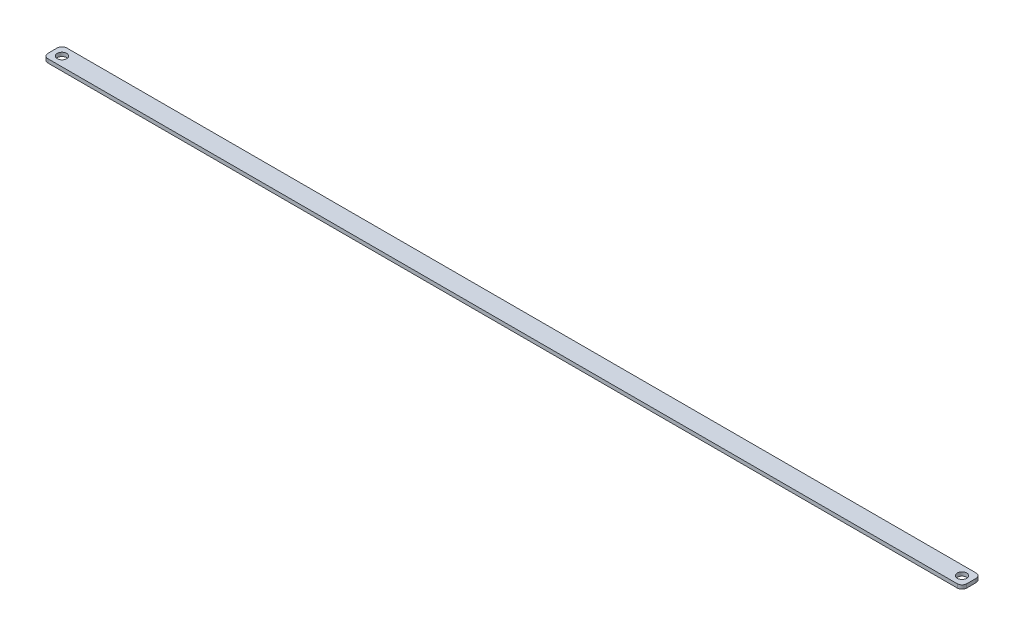
ISO-10303-21;
HEADER;
FILE_DESCRIPTION(('STEP AP214'),'2;1');
FILE_NAME('part.step','',(''),(''),'','','');
FILE_SCHEMA(('AUTOMOTIVE_DESIGN { 1 0 10303 214 1 1 1 1 }'));
ENDSEC;
DATA;
#1=APPLICATION_CONTEXT('core data for automotive mechanical design processes');
#2=APPLICATION_PROTOCOL_DEFINITION('international standard','automotive_design',2000,#1);
#3=PRODUCT_CONTEXT('',#1,'mechanical');
#4=PRODUCT('Part','Part','',(#3));
#5=PRODUCT_RELATED_PRODUCT_CATEGORY('part','',(#4));
#6=PRODUCT_DEFINITION_FORMATION('','',#4);
#7=PRODUCT_DEFINITION_CONTEXT('part definition',#1,'design');
#8=PRODUCT_DEFINITION('design','',#6,#7);
#9=PRODUCT_DEFINITION_SHAPE('','',#8);
#10=(LENGTH_UNIT() NAMED_UNIT(*) SI_UNIT(.MILLI.,.METRE.));
#11=(NAMED_UNIT(*) PLANE_ANGLE_UNIT() SI_UNIT($,.RADIAN.));
#12=(NAMED_UNIT(*) SI_UNIT($,.STERADIAN.) SOLID_ANGLE_UNIT());
#13=UNCERTAINTY_MEASURE_WITH_UNIT(LENGTH_MEASURE(1.E-05),#10,'distance_accuracy_value','');
#14=(GEOMETRIC_REPRESENTATION_CONTEXT(3) GLOBAL_UNCERTAINTY_ASSIGNED_CONTEXT((#13)) GLOBAL_UNIT_ASSIGNED_CONTEXT((#10,
#11,#12)) REPRESENTATION_CONTEXT('',''));
#15=CARTESIAN_POINT('',(0.,0.,0.));
#16=DIRECTION('',(0.,0.,1.));
#17=DIRECTION('',(1.,0.,0.));
#18=AXIS2_PLACEMENT_3D('',#15,#16,#17);
#19=CARTESIAN_POINT('',(270.312953067019,2.,-5.));
#20=DIRECTION('',(0.,-1.,0.));
#21=DIRECTION('',(0.,0.,-1.));
#22=AXIS2_PLACEMENT_3D('',#19,#20,#21);
#23=CYLINDRICAL_SURFACE('',#22,2.5);
#24=CARTESIAN_POINT('',(270.312953067019,0.,-5.));
#25=DIRECTION('',(0.,1.,0.));
#26=DIRECTION('',(0.,0.,1.));
#27=AXIS2_PLACEMENT_3D('',#24,#25,#26);
#28=CIRCLE('',#27,2.5);
#29=CARTESIAN_POINT('',(270.312953067019,0.,-2.5));
#30=VERTEX_POINT('',#29);
#31=EDGE_CURVE('E220',#30,#30,#28,.T.);
#32=ORIENTED_EDGE('',*,*,#31,.F.);
#33=EDGE_LOOP('',(#32));
#34=FACE_BOUND('',#33,.T.);
#35=CARTESIAN_POINT('',(270.312953067019,2.,-5.));
#36=DIRECTION('',(0.,1.,0.));
#37=DIRECTION('',(0.,0.,1.));
#38=AXIS2_PLACEMENT_3D('',#35,#36,#37);
#39=CIRCLE('',#38,2.5);
#40=CARTESIAN_POINT('',(270.312953067019,2.,-2.5));
#41=VERTEX_POINT('',#40);
#42=EDGE_CURVE('E13',#41,#41,#39,.T.);
#43=ORIENTED_EDGE('',*,*,#42,.T.);
#44=EDGE_LOOP('',(#43));
#45=FACE_BOUND('',#44,.T.);
#46=ADVANCED_FACE('F93',(#34,#45),#23,.F.);
#47=CARTESIAN_POINT('',(-209.687046932981,2.,-5.));
#48=DIRECTION('',(0.,-1.,0.));
#49=DIRECTION('',(0.,0.,-1.));
#50=AXIS2_PLACEMENT_3D('',#47,#48,#49);
#51=CYLINDRICAL_SURFACE('',#50,2.5);
#52=CARTESIAN_POINT('',(-209.687046932981,0.,-5.));
#53=DIRECTION('',(0.,1.,0.));
#54=DIRECTION('',(0.,0.,1.));
#55=AXIS2_PLACEMENT_3D('',#52,#53,#54);
#56=CIRCLE('',#55,2.5);
#57=CARTESIAN_POINT('',(-209.687046932981,0.,-2.5));
#58=VERTEX_POINT('',#57);
#59=EDGE_CURVE('E233',#58,#58,#56,.T.);
#60=ORIENTED_EDGE('',*,*,#59,.F.);
#61=EDGE_LOOP('',(#60));
#62=FACE_BOUND('',#61,.T.);
#63=CARTESIAN_POINT('',(-209.687046932981,2.,-5.));
#64=DIRECTION('',(0.,1.,0.));
#65=DIRECTION('',(0.,0.,1.));
#66=AXIS2_PLACEMENT_3D('',#63,#64,#65);
#67=CIRCLE('',#66,2.5);
#68=CARTESIAN_POINT('',(-209.687046932981,2.,-2.5));
#69=VERTEX_POINT('',#68);
#70=EDGE_CURVE('E103',#69,#69,#67,.T.);
#71=ORIENTED_EDGE('',*,*,#70,.T.);
#72=EDGE_LOOP('',(#71));
#73=FACE_BOUND('',#72,.T.);
#74=ADVANCED_FACE('F254',(#62,#73),#51,.F.);
#75=CARTESIAN_POINT('',(47.5,2.,-2.5));
#76=DIRECTION('',(0.,1.,0.));
#77=DIRECTION('',(0.,0.,1.));
#78=AXIS2_PLACEMENT_3D('',#75,#76,#77);
#79=PLANE('',#78);
#80=DIRECTION('',(1.,0.,0.));
#81=VECTOR('',#80,1.);
#82=CARTESIAN_POINT('',(-212.187046932981,2.,0.));
#83=LINE('',#82,#81);
#84=CARTESIAN_POINT('',(-212.187046932981,2.,0.));
#85=VERTEX_POINT('',#84);
#86=CARTESIAN_POINT('',(272.812953067019,2.,0.));
#87=VERTEX_POINT('',#86);
#88=EDGE_CURVE('E156',#85,#87,#83,.T.);
#89=ORIENTED_EDGE('',*,*,#88,.T.);
#90=CARTESIAN_POINT('',(272.812953067019,2.,-2.5));
#91=DIRECTION('',(0.,1.,0.));
#92=DIRECTION('',(0.,0.,1.));
#93=AXIS2_PLACEMENT_3D('',#90,#91,#92);
#94=CIRCLE('',#93,2.5);
#95=CARTESIAN_POINT('',(275.312953067019,2.,-2.50000000000002));
#96=VERTEX_POINT('',#95);
#97=EDGE_CURVE('E162',#87,#96,#94,.T.);
#98=ORIENTED_EDGE('',*,*,#97,.T.);
#99=DIRECTION('',(0.,0.,-1.));
#100=VECTOR('',#99,1.);
#101=CARTESIAN_POINT('',(275.312953067019,2.,-2.50000000000002));
#102=LINE('',#101,#100);
#103=CARTESIAN_POINT('',(275.312953067019,2.,-7.49999999999998));
#104=VERTEX_POINT('',#103);
#105=EDGE_CURVE('E184',#96,#104,#102,.T.);
#106=ORIENTED_EDGE('',*,*,#105,.T.);
#107=CARTESIAN_POINT('',(272.812953067019,2.,-7.5));
#108=DIRECTION('',(0.,1.,0.));
#109=DIRECTION('',(0.,0.,-1.));
#110=AXIS2_PLACEMENT_3D('',#107,#108,#109);
#111=CIRCLE('',#110,2.5);
#112=CARTESIAN_POINT('',(272.812953067019,2.,-10.));
#113=VERTEX_POINT('',#112);
#114=EDGE_CURVE('E188',#104,#113,#111,.T.);
#115=ORIENTED_EDGE('',*,*,#114,.T.);
#116=DIRECTION('',(-1.,0.,0.));
#117=VECTOR('',#116,1.);
#118=CARTESIAN_POINT('',(227.812953067019,2.,-10.));
#119=LINE('',#118,#117);
#120=CARTESIAN_POINT('',(-212.187046932981,2.,-10.));
#121=VERTEX_POINT('',#120);
#122=EDGE_CURVE('E242',#113,#121,#119,.T.);
#123=ORIENTED_EDGE('',*,*,#122,.T.);
#124=CARTESIAN_POINT('',(-212.187046932981,2.,-7.5));
#125=DIRECTION('',(0.,1.,0.));
#126=DIRECTION('',(0.,0.,-1.));
#127=AXIS2_PLACEMENT_3D('',#124,#125,#126);
#128=CIRCLE('',#127,2.5);
#129=CARTESIAN_POINT('',(-214.687046932981,2.,-7.49999999999998));
#130=VERTEX_POINT('',#129);
#131=EDGE_CURVE('E168',#121,#130,#128,.T.);
#132=ORIENTED_EDGE('',*,*,#131,.T.);
#133=DIRECTION('',(0.,0.,1.));
#134=VECTOR('',#133,1.);
#135=CARTESIAN_POINT('',(-214.687046932981,2.,-2.50000000000002));
#136=LINE('',#135,#134);
#137=CARTESIAN_POINT('',(-214.687046932981,2.,-2.50000000000002));
#138=VERTEX_POINT('',#137);
#139=EDGE_CURVE('E186',#130,#138,#136,.T.);
#140=ORIENTED_EDGE('',*,*,#139,.T.);
#141=CARTESIAN_POINT('',(-212.187046932981,2.,-2.5));
#142=DIRECTION('',(0.,1.,0.));
#143=DIRECTION('',(0.,0.,-1.));
#144=AXIS2_PLACEMENT_3D('',#141,#142,#143);
#145=CIRCLE('',#144,2.5);
#146=EDGE_CURVE('E165',#138,#85,#145,.T.);
#147=ORIENTED_EDGE('',*,*,#146,.T.);
#148=EDGE_LOOP('',(#89,#98,#106,#115,#123,#132,#140,#147));
#149=FACE_BOUND('',#148,.T.);
#150=ORIENTED_EDGE('',*,*,#42,.F.);
#151=EDGE_LOOP('',(#150));
#152=FACE_BOUND('',#151,.T.);
#153=ORIENTED_EDGE('',*,*,#70,.F.);
#154=EDGE_LOOP('',(#153));
#155=FACE_BOUND('',#154,.T.);
#156=ADVANCED_FACE('F158',(#149,#152,#155),#79,.T.);
#157=CARTESIAN_POINT('',(272.812953067019,0.,-2.5));
#158=DIRECTION('',(0.,1.,0.));
#159=DIRECTION('',(0.,0.,1.));
#160=AXIS2_PLACEMENT_3D('',#157,#158,#159);
#161=PLANE('',#160);
#162=ORIENTED_EDGE('',*,*,#31,.T.);
#163=EDGE_LOOP('',(#162));
#164=FACE_BOUND('',#163,.T.);
#165=CARTESIAN_POINT('',(272.812953067019,0.,-2.5));
#166=DIRECTION('',(0.,1.,0.));
#167=DIRECTION('',(0.,0.,1.));
#168=AXIS2_PLACEMENT_3D('',#165,#166,#167);
#169=CIRCLE('',#168,2.5);
#170=CARTESIAN_POINT('',(272.812953067019,0.,0.));
#171=VERTEX_POINT('',#170);
#172=CARTESIAN_POINT('',(275.312953067019,0.,-2.50000000000002));
#173=VERTEX_POINT('',#172);
#174=EDGE_CURVE('E177',#171,#173,#169,.T.);
#175=ORIENTED_EDGE('',*,*,#174,.F.);
#176=DIRECTION('',(1.,0.,0.));
#177=VECTOR('',#176,1.);
#178=CARTESIAN_POINT('',(-212.187046932981,0.,0.));
#179=LINE('',#178,#177);
#180=CARTESIAN_POINT('',(-212.187046932981,0.,0.));
#181=VERTEX_POINT('',#180);
#182=EDGE_CURVE('E173',#181,#171,#179,.T.);
#183=ORIENTED_EDGE('',*,*,#182,.F.);
#184=CARTESIAN_POINT('',(-212.187046932981,0.,-2.5));
#185=DIRECTION('',(0.,1.,0.));
#186=DIRECTION('',(0.,0.,-1.));
#187=AXIS2_PLACEMENT_3D('',#184,#185,#186);
#188=CIRCLE('',#187,2.5);
#189=CARTESIAN_POINT('',(-214.687046932981,0.,-2.50000000000002));
#190=VERTEX_POINT('',#189);
#191=EDGE_CURVE('E199',#190,#181,#188,.T.);
#192=ORIENTED_EDGE('',*,*,#191,.F.);
#193=DIRECTION('',(0.,0.,1.));
#194=VECTOR('',#193,1.);
#195=CARTESIAN_POINT('',(-214.687046932981,0.,-2.50000000000002));
#196=LINE('',#195,#194);
#197=CARTESIAN_POINT('',(-214.687046932981,0.,-7.49999999999998));
#198=VERTEX_POINT('',#197);
#199=EDGE_CURVE('E206',#198,#190,#196,.T.);
#200=ORIENTED_EDGE('',*,*,#199,.F.);
#201=CARTESIAN_POINT('',(-212.187046932981,0.,-7.5));
#202=DIRECTION('',(0.,1.,0.));
#203=DIRECTION('',(0.,0.,-1.));
#204=AXIS2_PLACEMENT_3D('',#201,#202,#203);
#205=CIRCLE('',#204,2.5);
#206=CARTESIAN_POINT('',(-212.187046932981,0.,-10.));
#207=VERTEX_POINT('',#206);
#208=EDGE_CURVE('E212',#207,#198,#205,.T.);
#209=ORIENTED_EDGE('',*,*,#208,.F.);
#210=DIRECTION('',(-1.,0.,0.));
#211=VECTOR('',#210,1.);
#212=CARTESIAN_POINT('',(227.812953067019,0.,-10.));
#213=LINE('',#212,#211);
#214=CARTESIAN_POINT('',(272.812953067019,0.,-10.));
#215=VERTEX_POINT('',#214);
#216=EDGE_CURVE('E218',#215,#207,#213,.T.);
#217=ORIENTED_EDGE('',*,*,#216,.F.);
#218=CARTESIAN_POINT('',(272.812953067019,0.,-7.5));
#219=DIRECTION('',(0.,1.,0.));
#220=DIRECTION('',(0.,0.,-1.));
#221=AXIS2_PLACEMENT_3D('',#218,#219,#220);
#222=CIRCLE('',#221,2.5);
#223=CARTESIAN_POINT('',(275.312953067019,0.,-7.49999999999998));
#224=VERTEX_POINT('',#223);
#225=EDGE_CURVE('E223',#224,#215,#222,.T.);
#226=ORIENTED_EDGE('',*,*,#225,.F.);
#227=DIRECTION('',(0.,0.,-1.));
#228=VECTOR('',#227,1.);
#229=CARTESIAN_POINT('',(275.312953067019,0.,-2.50000000000002));
#230=LINE('',#229,#228);
#231=EDGE_CURVE('E178',#173,#224,#230,.T.);
#232=ORIENTED_EDGE('',*,*,#231,.F.);
#233=EDGE_LOOP('',(#175,#183,#192,#200,#209,#217,#226,#232));
#234=FACE_BOUND('',#233,.T.);
#235=ORIENTED_EDGE('',*,*,#59,.T.);
#236=EDGE_LOOP('',(#235));
#237=FACE_BOUND('',#236,.T.);
#238=ADVANCED_FACE('F249',(#164,#234,#237),#161,.F.);
#239=CARTESIAN_POINT('',(227.812953067019,2.,-10.));
#240=DIRECTION('',(0.,0.,1.));
#241=DIRECTION('',(1.,0.,0.));
#242=AXIS2_PLACEMENT_3D('',#239,#240,#241);
#243=PLANE('',#242);
#244=ORIENTED_EDGE('',*,*,#216,.T.);
#245=DIRECTION('',(0.,-1.,0.));
#246=VECTOR('',#245,1.);
#247=CARTESIAN_POINT('',(-212.187046932981,2.,-10.));
#248=LINE('',#247,#246);
#249=EDGE_CURVE('E209',#121,#207,#248,.T.);
#250=ORIENTED_EDGE('',*,*,#249,.F.);
#251=ORIENTED_EDGE('',*,*,#122,.F.);
#252=DIRECTION('',(0.,-1.,0.));
#253=VECTOR('',#252,1.);
#254=CARTESIAN_POINT('',(272.812953067019,2.,-10.));
#255=LINE('',#254,#253);
#256=EDGE_CURVE('E112',#113,#215,#255,.T.);
#257=ORIENTED_EDGE('',*,*,#256,.T.);
#258=EDGE_LOOP('',(#244,#250,#251,#257));
#259=FACE_BOUND('',#258,.T.);
#260=ADVANCED_FACE('F271',(#259),#243,.F.);
#261=CARTESIAN_POINT('',(227.812953067019,2.,0.));
#262=DIRECTION('',(0.,0.,-1.));
#263=DIRECTION('',(-1.,0.,0.));
#264=AXIS2_PLACEMENT_3D('',#261,#262,#263);
#265=PLANE('',#264);
#266=DIRECTION('',(0.,-1.,0.));
#267=VECTOR('',#266,1.);
#268=CARTESIAN_POINT('',(272.812953067019,2.,0.));
#269=LINE('',#268,#267);
#270=EDGE_CURVE('E171',#87,#171,#269,.T.);
#271=ORIENTED_EDGE('',*,*,#270,.F.);
#272=ORIENTED_EDGE('',*,*,#88,.F.);
#273=DIRECTION('',(0.,-1.,0.));
#274=VECTOR('',#273,1.);
#275=CARTESIAN_POINT('',(-212.187046932981,2.,0.));
#276=LINE('',#275,#274);
#277=EDGE_CURVE('E196',#85,#181,#276,.T.);
#278=ORIENTED_EDGE('',*,*,#277,.T.);
#279=ORIENTED_EDGE('',*,*,#182,.T.);
#280=EDGE_LOOP('',(#271,#272,#278,#279));
#281=FACE_BOUND('',#280,.T.);
#282=ADVANCED_FACE('F172',(#281),#265,.F.);
#283=CARTESIAN_POINT('',(272.812953067019,2.,-2.5));
#284=DIRECTION('',(0.,-1.,0.));
#285=DIRECTION('',(0.,0.,-1.));
#286=AXIS2_PLACEMENT_3D('',#283,#284,#285);
#287=CYLINDRICAL_SURFACE('',#286,2.5);
#288=ORIENTED_EDGE('',*,*,#174,.T.);
#289=DIRECTION('',(0.,-1.,0.));
#290=VECTOR('',#289,1.);
#291=CARTESIAN_POINT('',(275.312953067019,2.,-2.50000000000002));
#292=LINE('',#291,#290);
#293=EDGE_CURVE('E182',#96,#173,#292,.T.);
#294=ORIENTED_EDGE('',*,*,#293,.F.);
#295=ORIENTED_EDGE('',*,*,#97,.F.);
#296=ORIENTED_EDGE('',*,*,#270,.T.);
#297=EDGE_LOOP('',(#288,#294,#295,#296));
#298=FACE_BOUND('',#297,.T.);
#299=ADVANCED_FACE('F180',(#298),#287,.T.);
#300=CARTESIAN_POINT('',(275.312953067019,2.,-2.50000000000002));
#301=DIRECTION('',(-1.,0.,0.));
#302=DIRECTION('',(0.,0.,1.));
#303=AXIS2_PLACEMENT_3D('',#300,#301,#302);
#304=PLANE('',#303);
#305=ORIENTED_EDGE('',*,*,#231,.T.);
#306=DIRECTION('',(0.,-1.,0.));
#307=VECTOR('',#306,1.);
#308=CARTESIAN_POINT('',(275.312953067019,2.,-7.49999999999998));
#309=LINE('',#308,#307);
#310=EDGE_CURVE('E215',#104,#224,#309,.T.);
#311=ORIENTED_EDGE('',*,*,#310,.F.);
#312=ORIENTED_EDGE('',*,*,#105,.F.);
#313=ORIENTED_EDGE('',*,*,#293,.T.);
#314=EDGE_LOOP('',(#305,#311,#312,#313));
#315=FACE_BOUND('',#314,.T.);
#316=ADVANCED_FACE('F278',(#315),#304,.F.);
#317=CARTESIAN_POINT('',(272.812953067019,2.,-7.5));
#318=DIRECTION('',(0.,-1.,0.));
#319=DIRECTION('',(0.,0.,-1.));
#320=AXIS2_PLACEMENT_3D('',#317,#318,#319);
#321=CYLINDRICAL_SURFACE('',#320,2.5);
#322=ORIENTED_EDGE('',*,*,#225,.T.);
#323=ORIENTED_EDGE('',*,*,#256,.F.);
#324=ORIENTED_EDGE('',*,*,#114,.F.);
#325=ORIENTED_EDGE('',*,*,#310,.T.);
#326=EDGE_LOOP('',(#322,#323,#324,#325));
#327=FACE_BOUND('',#326,.T.);
#328=ADVANCED_FACE('F281',(#327),#321,.T.);
#329=CARTESIAN_POINT('',(-212.187046932981,2.,-7.5));
#330=DIRECTION('',(0.,-1.,0.));
#331=DIRECTION('',(0.,0.,-1.));
#332=AXIS2_PLACEMENT_3D('',#329,#330,#331);
#333=CYLINDRICAL_SURFACE('',#332,2.5);
#334=ORIENTED_EDGE('',*,*,#208,.T.);
#335=DIRECTION('',(0.,-1.,0.));
#336=VECTOR('',#335,1.);
#337=CARTESIAN_POINT('',(-214.687046932981,2.,-7.49999999999998));
#338=LINE('',#337,#336);
#339=EDGE_CURVE('E202',#130,#198,#338,.T.);
#340=ORIENTED_EDGE('',*,*,#339,.F.);
#341=ORIENTED_EDGE('',*,*,#131,.F.);
#342=ORIENTED_EDGE('',*,*,#249,.T.);
#343=EDGE_LOOP('',(#334,#340,#341,#342));
#344=FACE_BOUND('',#343,.T.);
#345=ADVANCED_FACE('F285',(#344),#333,.T.);
#346=CARTESIAN_POINT('',(-214.687046932981,2.,-2.50000000000002));
#347=DIRECTION('',(1.,0.,0.));
#348=DIRECTION('',(0.,0.,-1.));
#349=AXIS2_PLACEMENT_3D('',#346,#347,#348);
#350=PLANE('',#349);
#351=ORIENTED_EDGE('',*,*,#199,.T.);
#352=DIRECTION('',(0.,-1.,0.));
#353=VECTOR('',#352,1.);
#354=CARTESIAN_POINT('',(-214.687046932981,2.,-2.50000000000002));
#355=LINE('',#354,#353);
#356=EDGE_CURVE('E203',#138,#190,#355,.T.);
#357=ORIENTED_EDGE('',*,*,#356,.F.);
#358=ORIENTED_EDGE('',*,*,#139,.F.);
#359=ORIENTED_EDGE('',*,*,#339,.T.);
#360=EDGE_LOOP('',(#351,#357,#358,#359));
#361=FACE_BOUND('',#360,.T.);
#362=ADVANCED_FACE('F288',(#361),#350,.F.);
#363=CARTESIAN_POINT('',(-212.187046932981,2.,-2.5));
#364=DIRECTION('',(0.,-1.,0.));
#365=DIRECTION('',(0.,0.,-1.));
#366=AXIS2_PLACEMENT_3D('',#363,#364,#365);
#367=CYLINDRICAL_SURFACE('',#366,2.5);
#368=ORIENTED_EDGE('',*,*,#191,.T.);
#369=ORIENTED_EDGE('',*,*,#277,.F.);
#370=ORIENTED_EDGE('',*,*,#146,.F.);
#371=ORIENTED_EDGE('',*,*,#356,.T.);
#372=EDGE_LOOP('',(#368,#369,#370,#371));
#373=FACE_BOUND('',#372,.T.);
#374=ADVANCED_FACE('F95',(#373),#367,.T.);
#375=CLOSED_SHELL('',(#46,#74,#156,#238,#260,#282,#299,#316,#328,#345,#362,#374));
#376=MANIFOLD_SOLID_BREP('B2',#375);
#377=ADVANCED_BREP_SHAPE_REPRESENTATION('',(#18,#376),#14);
#378=SHAPE_DEFINITION_REPRESENTATION(#9,#377);
ENDSEC;
END-ISO-10303-21;
